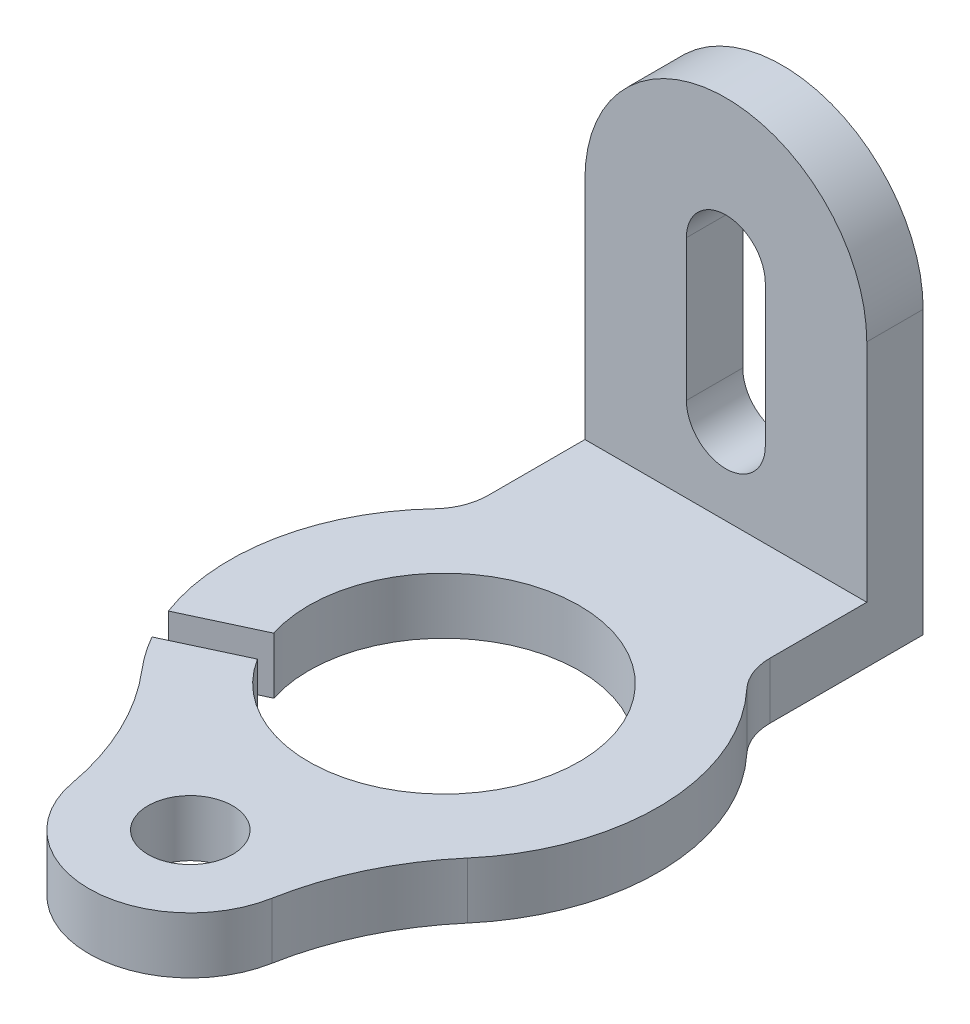
ISO-10303-21;
HEADER;
FILE_DESCRIPTION(('STEP AP214'),'2;1');
FILE_NAME('part.step','',(''),(''),'','','');
FILE_SCHEMA(('AUTOMOTIVE_DESIGN { 1 0 10303 214 1 1 1 1 }'));
ENDSEC;
DATA;
#1=APPLICATION_CONTEXT('core data for automotive mechanical design processes');
#2=APPLICATION_PROTOCOL_DEFINITION('international standard','automotive_design',2000,#1);
#3=PRODUCT_CONTEXT('',#1,'mechanical');
#4=PRODUCT('Part','Part','',(#3));
#5=PRODUCT_RELATED_PRODUCT_CATEGORY('part','',(#4));
#6=PRODUCT_DEFINITION_FORMATION('','',#4);
#7=PRODUCT_DEFINITION_CONTEXT('part definition',#1,'design');
#8=PRODUCT_DEFINITION('design','',#6,#7);
#9=PRODUCT_DEFINITION_SHAPE('','',#8);
#10=(LENGTH_UNIT() NAMED_UNIT(*) SI_UNIT(.MILLI.,.METRE.));
#11=(NAMED_UNIT(*) PLANE_ANGLE_UNIT() SI_UNIT($,.RADIAN.));
#12=(NAMED_UNIT(*) SI_UNIT($,.STERADIAN.) SOLID_ANGLE_UNIT());
#13=UNCERTAINTY_MEASURE_WITH_UNIT(LENGTH_MEASURE(1.E-05),#10,'distance_accuracy_value','');
#14=(GEOMETRIC_REPRESENTATION_CONTEXT(3) GLOBAL_UNCERTAINTY_ASSIGNED_CONTEXT((#13)) GLOBAL_UNIT_ASSIGNED_CONTEXT((#10,
#11,#12)) REPRESENTATION_CONTEXT('',''));
#15=CARTESIAN_POINT('',(0.,0.,0.));
#16=DIRECTION('',(0.,0.,1.));
#17=DIRECTION('',(1.,0.,0.));
#18=AXIS2_PLACEMENT_3D('',#15,#16,#17);
#19=CARTESIAN_POINT('',(0.,75.,0.));
#20=DIRECTION('',(0.,0.,1.));
#21=DIRECTION('',(1.,0.,0.));
#22=AXIS2_PLACEMENT_3D('',#19,#20,#21);
#23=PLANE('',#22);
#24=DIRECTION('',(0.,-1.,0.));
#25=VECTOR('',#24,1.);
#26=CARTESIAN_POINT('',(-6.99999999999999,0.,0.));
#27=LINE('',#26,#25);
#28=CARTESIAN_POINT('',(-7.,50.,0.));
#29=VERTEX_POINT('',#28);
#30=CARTESIAN_POINT('',(-7.,25.,0.));
#31=VERTEX_POINT('',#30);
#32=EDGE_CURVE('E111',#29,#31,#27,.T.);
#33=ORIENTED_EDGE('',*,*,#32,.F.);
#34=CARTESIAN_POINT('',(0.,50.,0.));
#35=DIRECTION('',(0.,0.,1.));
#36=DIRECTION('',(1.,0.,0.));
#37=AXIS2_PLACEMENT_3D('',#34,#35,#36);
#38=CIRCLE('',#37,7.);
#39=CARTESIAN_POINT('',(7.,50.,0.));
#40=VERTEX_POINT('',#39);
#41=EDGE_CURVE('E419',#40,#29,#38,.T.);
#42=ORIENTED_EDGE('',*,*,#41,.F.);
#43=DIRECTION('',(0.,-1.,0.));
#44=VECTOR('',#43,1.);
#45=CARTESIAN_POINT('',(7.00000000000001,0.,0.));
#46=LINE('',#45,#44);
#47=CARTESIAN_POINT('',(7.,25.,0.));
#48=VERTEX_POINT('',#47);
#49=EDGE_CURVE('E430',#40,#48,#46,.T.);
#50=ORIENTED_EDGE('',*,*,#49,.T.);
#51=CARTESIAN_POINT('',(0.,25.,0.));
#52=DIRECTION('',(0.,0.,1.));
#53=DIRECTION('',(1.,0.,0.));
#54=AXIS2_PLACEMENT_3D('',#51,#52,#53);
#55=CIRCLE('',#54,7.);
#56=EDGE_CURVE('E429',#31,#48,#55,.T.);
#57=ORIENTED_EDGE('',*,*,#56,.F.);
#58=EDGE_LOOP('',(#33,#42,#50,#57));
#59=FACE_BOUND('',#58,.T.);
#60=CARTESIAN_POINT('',(0.,50.,0.));
#61=DIRECTION('',(0.,0.,1.));
#62=DIRECTION('',(1.,0.,0.));
#63=AXIS2_PLACEMENT_3D('',#60,#61,#62);
#64=CIRCLE('',#63,25.);
#65=CARTESIAN_POINT('',(25.,50.,0.));
#66=VERTEX_POINT('',#65);
#67=CARTESIAN_POINT('',(-25.,50.,0.));
#68=VERTEX_POINT('',#67);
#69=EDGE_CURVE('E250',#66,#68,#64,.T.);
#70=ORIENTED_EDGE('',*,*,#69,.T.);
#71=DIRECTION('',(0.,-1.,0.));
#72=VECTOR('',#71,1.);
#73=CARTESIAN_POINT('',(-25.,75.,0.));
#74=LINE('',#73,#72);
#75=CARTESIAN_POINT('',(-25.,10.,0.));
#76=VERTEX_POINT('',#75);
#77=EDGE_CURVE('E255',#68,#76,#74,.T.);
#78=ORIENTED_EDGE('',*,*,#77,.T.);
#79=DIRECTION('',(-1.,0.,0.));
#80=VECTOR('',#79,1.);
#81=CARTESIAN_POINT('',(0.,10.,0.));
#82=LINE('',#81,#80);
#83=CARTESIAN_POINT('',(25.,9.99999999999999,0.));
#84=VERTEX_POINT('',#83);
#85=EDGE_CURVE('E294',#84,#76,#82,.T.);
#86=ORIENTED_EDGE('',*,*,#85,.F.);
#87=DIRECTION('',(0.,-1.,0.));
#88=VECTOR('',#87,1.);
#89=CARTESIAN_POINT('',(25.,75.,0.));
#90=LINE('',#89,#88);
#91=EDGE_CURVE('E263',#66,#84,#90,.T.);
#92=ORIENTED_EDGE('',*,*,#91,.F.);
#93=EDGE_LOOP('',(#70,#78,#86,#92));
#94=FACE_BOUND('',#93,.T.);
#95=ADVANCED_FACE('F97',(#59,#94),#23,.T.);
#96=CARTESIAN_POINT('',(-25.,10.,0.));
#97=DIRECTION('',(1.,0.,0.));
#98=DIRECTION('',(0.,0.,-1.));
#99=AXIS2_PLACEMENT_3D('',#96,#97,#98);
#100=PLANE('',#99);
#101=DIRECTION('',(0.,0.,1.));
#102=VECTOR('',#101,1.);
#103=CARTESIAN_POINT('',(-25.,50.,-10.001));
#104=LINE('',#103,#102);
#105=CARTESIAN_POINT('',(-25.,50.,-9.99999999999999));
#106=VERTEX_POINT('',#105);
#107=EDGE_CURVE('E238',#106,#68,#104,.T.);
#108=ORIENTED_EDGE('',*,*,#107,.F.);
#109=DIRECTION('',(0.,-1.,0.));
#110=VECTOR('',#109,1.);
#111=CARTESIAN_POINT('',(-25.,75.,-9.99999999999999));
#112=LINE('',#111,#110);
#113=CARTESIAN_POINT('',(-25.,0.,-9.99999999999999));
#114=VERTEX_POINT('',#113);
#115=EDGE_CURVE('E253',#106,#114,#112,.T.);
#116=ORIENTED_EDGE('',*,*,#115,.T.);
#117=DIRECTION('',(0.,0.,1.));
#118=VECTOR('',#117,1.);
#119=CARTESIAN_POINT('',(-25.,0.,0.));
#120=LINE('',#119,#118);
#121=CARTESIAN_POINT('',(-25.,0.,17.1518645886863));
#122=VERTEX_POINT('',#121);
#123=EDGE_CURVE('E331',#114,#122,#120,.T.);
#124=ORIENTED_EDGE('',*,*,#123,.T.);
#125=DIRECTION('',(0.,-1.,0.));
#126=VECTOR('',#125,1.);
#127=CARTESIAN_POINT('',(-25.,10.,17.1518645886863));
#128=LINE('',#127,#126);
#129=CARTESIAN_POINT('',(-25.,10.,17.1518645886863));
#130=VERTEX_POINT('',#129);
#131=EDGE_CURVE('E351',#130,#122,#128,.T.);
#132=ORIENTED_EDGE('',*,*,#131,.F.);
#133=DIRECTION('',(0.,0.,1.));
#134=VECTOR('',#133,1.);
#135=CARTESIAN_POINT('',(-25.,10.,0.));
#136=LINE('',#135,#134);
#137=EDGE_CURVE('E300',#76,#130,#136,.T.);
#138=ORIENTED_EDGE('',*,*,#137,.F.);
#139=ORIENTED_EDGE('',*,*,#77,.F.);
#140=EDGE_LOOP('',(#108,#116,#124,#132,#138,#139));
#141=FACE_BOUND('',#140,.T.);
#142=ADVANCED_FACE('F248',(#141),#100,.F.);
#143=CARTESIAN_POINT('',(25.,10.,0.));
#144=DIRECTION('',(1.,0.,0.));
#145=DIRECTION('',(0.,0.,-1.));
#146=AXIS2_PLACEMENT_3D('',#143,#144,#145);
#147=PLANE('',#146);
#148=DIRECTION('',(0.,-1.,0.));
#149=VECTOR('',#148,1.);
#150=CARTESIAN_POINT('',(25.,75.,-10.));
#151=LINE('',#150,#149);
#152=CARTESIAN_POINT('',(25.,50.,-10.));
#153=VERTEX_POINT('',#152);
#154=CARTESIAN_POINT('',(25.,0.,-10.));
#155=VERTEX_POINT('',#154);
#156=EDGE_CURVE('E261',#153,#155,#151,.T.);
#157=ORIENTED_EDGE('',*,*,#156,.F.);
#158=DIRECTION('',(0.,0.,1.));
#159=VECTOR('',#158,1.);
#160=CARTESIAN_POINT('',(25.,50.,-10.001));
#161=LINE('',#160,#159);
#162=EDGE_CURVE('E244',#153,#66,#161,.T.);
#163=ORIENTED_EDGE('',*,*,#162,.T.);
#164=ORIENTED_EDGE('',*,*,#91,.T.);
#165=DIRECTION('',(0.,0.,1.));
#166=VECTOR('',#165,1.);
#167=CARTESIAN_POINT('',(25.,10.,0.));
#168=LINE('',#167,#166);
#169=CARTESIAN_POINT('',(25.,10.,17.1518645886863));
#170=VERTEX_POINT('',#169);
#171=EDGE_CURVE('E292',#84,#170,#168,.T.);
#172=ORIENTED_EDGE('',*,*,#171,.T.);
#173=DIRECTION('',(0.,-1.,0.));
#174=VECTOR('',#173,1.);
#175=CARTESIAN_POINT('',(25.,10.,17.1518645886863));
#176=LINE('',#175,#174);
#177=CARTESIAN_POINT('',(25.,0.,17.1518645886863));
#178=VERTEX_POINT('',#177);
#179=EDGE_CURVE('E360',#170,#178,#176,.T.);
#180=ORIENTED_EDGE('',*,*,#179,.T.);
#181=DIRECTION('',(0.,0.,1.));
#182=VECTOR('',#181,1.);
#183=CARTESIAN_POINT('',(25.,0.,0.));
#184=LINE('',#183,#182);
#185=EDGE_CURVE('E332',#155,#178,#184,.T.);
#186=ORIENTED_EDGE('',*,*,#185,.F.);
#187=EDGE_LOOP('',(#157,#163,#164,#172,#180,#186));
#188=FACE_BOUND('',#187,.T.);
#189=ADVANCED_FACE('F447',(#188),#147,.T.);
#190=CARTESIAN_POINT('',(20.4189658631966,10.,43.7886136032735));
#191=DIRECTION('',(0.4226182617407,0.,0.90630778703665));
#192=DIRECTION('',(0.90630778703665,0.,-0.4226182617407));
#193=AXIS2_PLACEMENT_3D('',#190,#191,#192);
#194=PLANE('',#193);
#195=DIRECTION('',(-0.90630778703665,0.,0.4226182617407));
#196=VECTOR('',#195,1.);
#197=CARTESIAN_POINT('',(20.4189658631966,0.,43.7886136032735));
#198=LINE('',#197,#196);
#199=CARTESIAN_POINT('',(-20.3129303568002,0.,62.7822087418326));
#200=VERTEX_POINT('',#199);
#201=CARTESIAN_POINT('',(-33.06434744461,0.,68.7282921822069));
#202=VERTEX_POINT('',#201);
#203=EDGE_CURVE('E315',#200,#202,#198,.T.);
#204=ORIENTED_EDGE('',*,*,#203,.T.);
#205=DIRECTION('',(0.,-1.,0.));
#206=VECTOR('',#205,1.);
#207=CARTESIAN_POINT('',(-33.06434744461,10.,68.7282921822069));
#208=LINE('',#207,#206);
#209=CARTESIAN_POINT('',(-33.06434744461,10.,68.7282921822069));
#210=VERTEX_POINT('',#209);
#211=EDGE_CURVE('E12',#210,#202,#208,.T.);
#212=ORIENTED_EDGE('',*,*,#211,.F.);
#213=DIRECTION('',(-0.90630778703665,0.,0.4226182617407));
#214=VECTOR('',#213,1.);
#215=CARTESIAN_POINT('',(20.4189658631966,10.,43.7886136032735));
#216=LINE('',#215,#214);
#217=CARTESIAN_POINT('',(-20.3129303568002,10.,62.7822087418326));
#218=VERTEX_POINT('',#217);
#219=EDGE_CURVE('E272',#218,#210,#216,.T.);
#220=ORIENTED_EDGE('',*,*,#219,.F.);
#221=DIRECTION('',(0.,-1.,0.));
#222=VECTOR('',#221,1.);
#223=CARTESIAN_POINT('',(-20.3129303568002,10.,62.7822087418326));
#224=LINE('',#223,#222);
#225=EDGE_CURVE('E310',#218,#200,#224,.T.);
#226=ORIENTED_EDGE('',*,*,#225,.T.);
#227=EDGE_LOOP('',(#204,#212,#220,#226));
#228=FACE_BOUND('',#227,.T.);
#229=ADVANCED_FACE('F394',(#228),#194,.F.);
#230=CARTESIAN_POINT('',(0.,10.,50.));
#231=DIRECTION('',(0.,-1.,0.));
#232=DIRECTION('',(0.,0.,-1.));
#233=AXIS2_PLACEMENT_3D('',#230,#231,#232);
#234=CYLINDRICAL_SURFACE('',#233,38.);
#235=CARTESIAN_POINT('',(0.,0.,50.));
#236=DIRECTION('',(0.,1.,0.));
#237=DIRECTION('',(0.,0.,1.));
#238=AXIS2_PLACEMENT_3D('',#235,#236,#237);
#239=CIRCLE('',#238,38.);
#240=CARTESIAN_POINT('',(-28.8898053544943,0.,74.6856060606061));
#241=VERTEX_POINT('',#240);
#242=EDGE_CURVE('E312',#202,#241,#239,.T.);
#243=ORIENTED_EDGE('',*,*,#242,.T.);
#244=DIRECTION('',(0.,-1.,0.));
#245=VECTOR('',#244,1.);
#246=CARTESIAN_POINT('',(-28.8898053544943,10.,74.6856060606061));
#247=LINE('',#246,#245);
#248=CARTESIAN_POINT('',(-28.8898053544943,10.,74.6856060606061));
#249=VERTEX_POINT('',#248);
#250=EDGE_CURVE('E110',#249,#241,#247,.T.);
#251=ORIENTED_EDGE('',*,*,#250,.F.);
#252=CARTESIAN_POINT('',(0.,10.,50.));
#253=DIRECTION('',(0.,1.,0.));
#254=DIRECTION('',(0.,0.,1.));
#255=AXIS2_PLACEMENT_3D('',#252,#253,#254);
#256=CIRCLE('',#255,38.);
#257=EDGE_CURVE('E280',#210,#249,#256,.T.);
#258=ORIENTED_EDGE('',*,*,#257,.F.);
#259=ORIENTED_EDGE('',*,*,#211,.T.);
#260=EDGE_LOOP('',(#243,#251,#258,#259));
#261=FACE_BOUND('',#260,.T.);
#262=ADVANCED_FACE('F392',(#261),#234,.T.);
#263=CARTESIAN_POINT('',(-66.9027071367237,10.,107.166666666667));
#264=DIRECTION('',(0.,-1.,0.));
#265=DIRECTION('',(0.,0.,-1.));
#266=AXIS2_PLACEMENT_3D('',#263,#264,#265);
#267=CYLINDRICAL_SURFACE('',#266,50.);
#268=CARTESIAN_POINT('',(-66.9027071367237,0.,107.166666666667));
#269=DIRECTION('',(0.,1.,0.));
#270=DIRECTION('',(0.,0.,1.));
#271=AXIS2_PLACEMENT_3D('',#268,#269,#270);
#272=CIRCLE('',#271,50.);
#273=CARTESIAN_POINT('',(-17.7095401244269,0.,98.2205882352941));
#274=VERTEX_POINT('',#273);
#275=EDGE_CURVE('E320',#241,#274,#272,.F.);
#276=ORIENTED_EDGE('',*,*,#275,.T.);
#277=DIRECTION('',(0.,-1.,0.));
#278=VECTOR('',#277,1.);
#279=CARTESIAN_POINT('',(-17.7095401244269,10.,98.2205882352941));
#280=LINE('',#279,#278);
#281=CARTESIAN_POINT('',(-17.7095401244269,10.,98.2205882352941));
#282=VERTEX_POINT('',#281);
#283=EDGE_CURVE('E364',#282,#274,#280,.T.);
#284=ORIENTED_EDGE('',*,*,#283,.F.);
#285=CARTESIAN_POINT('',(-66.9027071367237,10.,107.166666666667));
#286=DIRECTION('',(0.,1.,0.));
#287=DIRECTION('',(0.,0.,1.));
#288=AXIS2_PLACEMENT_3D('',#285,#286,#287);
#289=CIRCLE('',#288,50.);
#290=EDGE_CURVE('E276',#249,#282,#289,.F.);
#291=ORIENTED_EDGE('',*,*,#290,.F.);
#292=ORIENTED_EDGE('',*,*,#250,.T.);
#293=EDGE_LOOP('',(#276,#284,#291,#292));
#294=FACE_BOUND('',#293,.T.);
#295=ADVANCED_FACE('F375',(#294),#267,.F.);
#296=CARTESIAN_POINT('',(0.,10.,95.));
#297=DIRECTION('',(0.,-1.,0.));
#298=DIRECTION('',(0.,0.,-1.));
#299=AXIS2_PLACEMENT_3D('',#296,#297,#298);
#300=CYLINDRICAL_SURFACE('',#299,18.);
#301=CARTESIAN_POINT('',(0.,0.,95.));
#302=DIRECTION('',(0.,1.,0.));
#303=DIRECTION('',(0.,0.,1.));
#304=AXIS2_PLACEMENT_3D('',#301,#302,#303);
#305=CIRCLE('',#304,18.);
#306=CARTESIAN_POINT('',(17.7095401244269,0.,98.2205882352941));
#307=VERTEX_POINT('',#306);
#308=EDGE_CURVE('E317',#274,#307,#305,.T.);
#309=ORIENTED_EDGE('',*,*,#308,.T.);
#310=DIRECTION('',(0.,-1.,0.));
#311=VECTOR('',#310,1.);
#312=CARTESIAN_POINT('',(17.7095401244269,10.,98.2205882352941));
#313=LINE('',#312,#311);
#314=CARTESIAN_POINT('',(17.7095401244269,10.,98.2205882352941));
#315=VERTEX_POINT('',#314);
#316=EDGE_CURVE('E361',#315,#307,#313,.T.);
#317=ORIENTED_EDGE('',*,*,#316,.F.);
#318=CARTESIAN_POINT('',(0.,10.,95.));
#319=DIRECTION('',(0.,1.,0.));
#320=DIRECTION('',(0.,0.,1.));
#321=AXIS2_PLACEMENT_3D('',#318,#319,#320);
#322=CIRCLE('',#321,18.);
#323=EDGE_CURVE('E282',#282,#315,#322,.T.);
#324=ORIENTED_EDGE('',*,*,#323,.F.);
#325=ORIENTED_EDGE('',*,*,#283,.T.);
#326=EDGE_LOOP('',(#309,#317,#324,#325));
#327=FACE_BOUND('',#326,.T.);
#328=ADVANCED_FACE('F382',(#327),#300,.T.);
#329=CARTESIAN_POINT('',(66.9027071367237,10.,107.166666666667));
#330=DIRECTION('',(0.,-1.,0.));
#331=DIRECTION('',(0.,0.,-1.));
#332=AXIS2_PLACEMENT_3D('',#329,#330,#331);
#333=CYLINDRICAL_SURFACE('',#332,50.);
#334=CARTESIAN_POINT('',(66.9027071367237,0.,107.166666666667));
#335=DIRECTION('',(0.,1.,0.));
#336=DIRECTION('',(0.,0.,1.));
#337=AXIS2_PLACEMENT_3D('',#334,#335,#336);
#338=CIRCLE('',#337,50.);
#339=CARTESIAN_POINT('',(28.8898053544943,0.,74.6856060606061));
#340=VERTEX_POINT('',#339);
#341=EDGE_CURVE('E325',#340,#307,#338,.T.);
#342=ORIENTED_EDGE('',*,*,#341,.F.);
#343=DIRECTION('',(0.,-1.,0.));
#344=VECTOR('',#343,1.);
#345=CARTESIAN_POINT('',(28.8898053544943,10.,74.6856060606061));
#346=LINE('',#345,#344);
#347=CARTESIAN_POINT('',(28.8898053544943,10.,74.6856060606061));
#348=VERTEX_POINT('',#347);
#349=EDGE_CURVE('E363',#348,#340,#346,.T.);
#350=ORIENTED_EDGE('',*,*,#349,.F.);
#351=CARTESIAN_POINT('',(66.9027071367237,10.,107.166666666667));
#352=DIRECTION('',(0.,1.,0.));
#353=DIRECTION('',(0.,0.,1.));
#354=AXIS2_PLACEMENT_3D('',#351,#352,#353);
#355=CIRCLE('',#354,50.);
#356=EDGE_CURVE('E284',#348,#315,#355,.T.);
#357=ORIENTED_EDGE('',*,*,#356,.T.);
#358=ORIENTED_EDGE('',*,*,#316,.T.);
#359=EDGE_LOOP('',(#342,#350,#357,#358));
#360=FACE_BOUND('',#359,.T.);
#361=ADVANCED_FACE('F453',(#360),#333,.F.);
#362=CARTESIAN_POINT('',(0.,10.,50.));
#363=DIRECTION('',(0.,-1.,0.));
#364=DIRECTION('',(0.,0.,-1.));
#365=AXIS2_PLACEMENT_3D('',#362,#363,#364);
#366=CYLINDRICAL_SURFACE('',#365,38.);
#367=CARTESIAN_POINT('',(0.,0.,50.));
#368=DIRECTION('',(0.,1.,0.));
#369=DIRECTION('',(0.,0.,1.));
#370=AXIS2_PLACEMENT_3D('',#367,#368,#369);
#371=CIRCLE('',#370,38.);
#372=CARTESIAN_POINT('',(27.7083333333333,0.,23.99522613271));
#373=VERTEX_POINT('',#372);
#374=EDGE_CURVE('E324',#340,#373,#371,.T.);
#375=ORIENTED_EDGE('',*,*,#374,.T.);
#376=DIRECTION('',(0.,-1.,0.));
#377=VECTOR('',#376,1.);
#378=CARTESIAN_POINT('',(27.7083333333333,10.,23.99522613271));
#379=LINE('',#378,#377);
#380=CARTESIAN_POINT('',(27.7083333333333,10.,23.99522613271));
#381=VERTEX_POINT('',#380);
#382=EDGE_CURVE('E356',#381,#373,#379,.T.);
#383=ORIENTED_EDGE('',*,*,#382,.F.);
#384=CARTESIAN_POINT('',(0.,10.,50.));
#385=DIRECTION('',(0.,1.,0.));
#386=DIRECTION('',(0.,0.,1.));
#387=AXIS2_PLACEMENT_3D('',#384,#385,#386);
#388=CIRCLE('',#387,38.);
#389=EDGE_CURVE('E287',#348,#381,#388,.T.);
#390=ORIENTED_EDGE('',*,*,#389,.F.);
#391=ORIENTED_EDGE('',*,*,#349,.T.);
#392=EDGE_LOOP('',(#375,#383,#390,#391));
#393=FACE_BOUND('',#392,.T.);
#394=ADVANCED_FACE('F460',(#393),#366,.T.);
#395=CARTESIAN_POINT('',(35.,10.,17.1518645886863));
#396=DIRECTION('',(0.,-1.,0.));
#397=DIRECTION('',(0.,0.,-1.));
#398=AXIS2_PLACEMENT_3D('',#395,#396,#397);
#399=CYLINDRICAL_SURFACE('',#398,10.);
#400=CARTESIAN_POINT('',(35.,0.,17.1518645886863));
#401=DIRECTION('',(0.,1.,0.));
#402=DIRECTION('',(0.,0.,1.));
#403=AXIS2_PLACEMENT_3D('',#400,#401,#402);
#404=CIRCLE('',#403,10.);
#405=EDGE_CURVE('E327',#178,#373,#404,.T.);
#406=ORIENTED_EDGE('',*,*,#405,.F.);
#407=ORIENTED_EDGE('',*,*,#179,.F.);
#408=CARTESIAN_POINT('',(35.,10.,17.1518645886863));
#409=DIRECTION('',(0.,1.,0.));
#410=DIRECTION('',(0.,0.,1.));
#411=AXIS2_PLACEMENT_3D('',#408,#409,#410);
#412=CIRCLE('',#411,10.);
#413=EDGE_CURVE('E289',#170,#381,#412,.T.);
#414=ORIENTED_EDGE('',*,*,#413,.T.);
#415=ORIENTED_EDGE('',*,*,#382,.T.);
#416=EDGE_LOOP('',(#406,#407,#414,#415));
#417=FACE_BOUND('',#416,.T.);
#418=ADVANCED_FACE('F452',(#417),#399,.F.);
#419=CARTESIAN_POINT('',(-35.,10.,17.1518645886863));
#420=DIRECTION('',(0.,-1.,0.));
#421=DIRECTION('',(0.,0.,-1.));
#422=AXIS2_PLACEMENT_3D('',#419,#420,#421);
#423=CYLINDRICAL_SURFACE('',#422,10.);
#424=CARTESIAN_POINT('',(-35.,0.,17.1518645886863));
#425=DIRECTION('',(0.,1.,0.));
#426=DIRECTION('',(0.,0.,1.));
#427=AXIS2_PLACEMENT_3D('',#424,#425,#426);
#428=CIRCLE('',#427,10.);
#429=CARTESIAN_POINT('',(-27.7083333333333,0.,23.99522613271));
#430=VERTEX_POINT('',#429);
#431=EDGE_CURVE('E337',#122,#430,#428,.F.);
#432=ORIENTED_EDGE('',*,*,#431,.T.);
#433=DIRECTION('',(0.,-1.,0.));
#434=VECTOR('',#433,1.);
#435=CARTESIAN_POINT('',(-27.7083333333333,10.,23.99522613271));
#436=LINE('',#435,#434);
#437=CARTESIAN_POINT('',(-27.7083333333333,10.,23.99522613271));
#438=VERTEX_POINT('',#437);
#439=EDGE_CURVE('E352',#438,#430,#436,.T.);
#440=ORIENTED_EDGE('',*,*,#439,.F.);
#441=CARTESIAN_POINT('',(-35.,10.,17.1518645886863));
#442=DIRECTION('',(0.,1.,0.));
#443=DIRECTION('',(0.,0.,1.));
#444=AXIS2_PLACEMENT_3D('',#441,#442,#443);
#445=CIRCLE('',#444,10.);
#446=EDGE_CURVE('E296',#130,#438,#445,.F.);
#447=ORIENTED_EDGE('',*,*,#446,.F.);
#448=ORIENTED_EDGE('',*,*,#131,.T.);
#449=EDGE_LOOP('',(#432,#440,#447,#448));
#450=FACE_BOUND('',#449,.T.);
#451=ADVANCED_FACE('F408',(#450),#423,.F.);
#452=CARTESIAN_POINT('',(0.,10.,50.));
#453=DIRECTION('',(0.,-1.,0.));
#454=DIRECTION('',(0.,0.,-1.));
#455=AXIS2_PLACEMENT_3D('',#452,#453,#454);
#456=CYLINDRICAL_SURFACE('',#455,38.);
#457=CARTESIAN_POINT('',(0.,0.,50.));
#458=DIRECTION('',(0.,1.,0.));
#459=DIRECTION('',(0.,0.,1.));
#460=AXIS2_PLACEMENT_3D('',#457,#458,#459);
#461=CIRCLE('',#460,38.);
#462=CARTESIAN_POINT('',(-35.6000570150542,0.,63.290445459987));
#463=VERTEX_POINT('',#462);
#464=EDGE_CURVE('E339',#430,#463,#461,.T.);
#465=ORIENTED_EDGE('',*,*,#464,.T.);
#466=DIRECTION('',(0.,-1.,0.));
#467=VECTOR('',#466,1.);
#468=CARTESIAN_POINT('',(-35.6000570150542,10.,63.290445459987));
#469=LINE('',#468,#467);
#470=CARTESIAN_POINT('',(-35.6000570150542,10.,63.290445459987));
#471=VERTEX_POINT('',#470);
#472=EDGE_CURVE('E349',#471,#463,#469,.T.);
#473=ORIENTED_EDGE('',*,*,#472,.F.);
#474=CARTESIAN_POINT('',(0.,10.,50.));
#475=DIRECTION('',(0.,1.,0.));
#476=DIRECTION('',(0.,0.,1.));
#477=AXIS2_PLACEMENT_3D('',#474,#475,#476);
#478=CIRCLE('',#477,38.);
#479=EDGE_CURVE('E302',#438,#471,#478,.T.);
#480=ORIENTED_EDGE('',*,*,#479,.F.);
#481=ORIENTED_EDGE('',*,*,#439,.T.);
#482=EDGE_LOOP('',(#465,#473,#480,#481));
#483=FACE_BOUND('',#482,.T.);
#484=ADVANCED_FACE('F403',(#483),#456,.T.);
#485=CARTESIAN_POINT('',(17.8832562927524,10.,38.3507668810535));
#486=DIRECTION('',(0.422618261740701,0.,0.90630778703665));
#487=DIRECTION('',(0.90630778703665,0.,-0.422618261740701));
#488=AXIS2_PLACEMENT_3D('',#485,#486,#487);
#489=PLANE('',#488);
#490=DIRECTION('',(-0.90630778703665,0.,0.422618261740701));
#491=VECTOR('',#490,1.);
#492=CARTESIAN_POINT('',(17.8832562927524,0.,38.3507668810535));
#493=LINE('',#492,#491);
#494=CARTESIAN_POINT('',(-22.8486399272445,0.,57.3443620196128));
#495=VERTEX_POINT('',#494);
#496=EDGE_CURVE('E342',#495,#463,#493,.T.);
#497=ORIENTED_EDGE('',*,*,#496,.F.);
#498=DIRECTION('',(0.,-1.,0.));
#499=VECTOR('',#498,1.);
#500=CARTESIAN_POINT('',(-22.8486399272445,10.,57.3443620196128));
#501=LINE('',#500,#499);
#502=CARTESIAN_POINT('',(-22.8486399272445,10.,57.3443620196128));
#503=VERTEX_POINT('',#502);
#504=EDGE_CURVE('E350',#503,#495,#501,.T.);
#505=ORIENTED_EDGE('',*,*,#504,.F.);
#506=DIRECTION('',(-0.90630778703665,0.,0.422618261740701));
#507=VECTOR('',#506,1.);
#508=CARTESIAN_POINT('',(17.8832562927524,10.,38.3507668810535));
#509=LINE('',#508,#507);
#510=EDGE_CURVE('E304',#503,#471,#509,.T.);
#511=ORIENTED_EDGE('',*,*,#510,.T.);
#512=ORIENTED_EDGE('',*,*,#472,.T.);
#513=EDGE_LOOP('',(#497,#505,#511,#512));
#514=FACE_BOUND('',#513,.T.);
#515=ADVANCED_FACE('F398',(#514),#489,.T.);
#516=CARTESIAN_POINT('',(0.,10.,95.));
#517=DIRECTION('',(0.,-1.,0.));
#518=DIRECTION('',(0.,0.,-1.));
#519=AXIS2_PLACEMENT_3D('',#516,#517,#518);
#520=CYLINDRICAL_SURFACE('',#519,7.5);
#521=CARTESIAN_POINT('',(0.,10.,95.));
#522=DIRECTION('',(0.,1.,0.));
#523=DIRECTION('',(0.,0.,1.));
#524=AXIS2_PLACEMENT_3D('',#521,#522,#523);
#525=CIRCLE('',#524,7.5);
#526=CARTESIAN_POINT('',(0.,10.,102.5));
#527=VERTEX_POINT('',#526);
#528=EDGE_CURVE('E269',#527,#527,#525,.T.);
#529=ORIENTED_EDGE('',*,*,#528,.T.);
#530=EDGE_LOOP('',(#529));
#531=FACE_BOUND('',#530,.T.);
#532=CARTESIAN_POINT('',(0.,0.,95.));
#533=DIRECTION('',(0.,1.,0.));
#534=DIRECTION('',(0.,0.,1.));
#535=AXIS2_PLACEMENT_3D('',#532,#533,#534);
#536=CIRCLE('',#535,7.5);
#537=CARTESIAN_POINT('',(0.,0.,102.5));
#538=VERTEX_POINT('',#537);
#539=EDGE_CURVE('E267',#538,#538,#536,.T.);
#540=ORIENTED_EDGE('',*,*,#539,.F.);
#541=EDGE_LOOP('',(#540));
#542=FACE_BOUND('',#541,.T.);
#543=ADVANCED_FACE('F101',(#531,#542),#520,.F.);
#544=CARTESIAN_POINT('',(0.,10.,50.));
#545=DIRECTION('',(0.,-1.,0.));
#546=DIRECTION('',(0.,0.,-1.));
#547=AXIS2_PLACEMENT_3D('',#544,#545,#546);
#548=CYLINDRICAL_SURFACE('',#547,24.);
#549=CARTESIAN_POINT('',(0.,0.,50.));
#550=DIRECTION('',(0.,1.,0.));
#551=DIRECTION('',(0.,0.,1.));
#552=AXIS2_PLACEMENT_3D('',#549,#550,#551);
#553=CIRCLE('',#552,24.);
#554=EDGE_CURVE('E273',#200,#495,#553,.T.);
#555=ORIENTED_EDGE('',*,*,#554,.F.);
#556=ORIENTED_EDGE('',*,*,#225,.F.);
#557=CARTESIAN_POINT('',(0.,10.,50.));
#558=DIRECTION('',(0.,1.,0.));
#559=DIRECTION('',(0.,0.,1.));
#560=AXIS2_PLACEMENT_3D('',#557,#558,#559);
#561=CIRCLE('',#560,24.);
#562=EDGE_CURVE('E308',#218,#503,#561,.T.);
#563=ORIENTED_EDGE('',*,*,#562,.T.);
#564=ORIENTED_EDGE('',*,*,#504,.T.);
#565=EDGE_LOOP('',(#555,#556,#563,#564));
#566=FACE_BOUND('',#565,.T.);
#567=ADVANCED_FACE('F397',(#566),#548,.F.);
#568=CARTESIAN_POINT('',(0.,10.,0.));
#569=DIRECTION('',(0.,1.,0.));
#570=DIRECTION('',(0.,0.,1.));
#571=AXIS2_PLACEMENT_3D('',#568,#569,#570);
#572=PLANE('',#571);
#573=ORIENTED_EDGE('',*,*,#528,.F.);
#574=EDGE_LOOP('',(#573));
#575=FACE_BOUND('',#574,.T.);
#576=ORIENTED_EDGE('',*,*,#219,.T.);
#577=ORIENTED_EDGE('',*,*,#257,.T.);
#578=ORIENTED_EDGE('',*,*,#290,.T.);
#579=ORIENTED_EDGE('',*,*,#323,.T.);
#580=ORIENTED_EDGE('',*,*,#356,.F.);
#581=ORIENTED_EDGE('',*,*,#389,.T.);
#582=ORIENTED_EDGE('',*,*,#413,.F.);
#583=ORIENTED_EDGE('',*,*,#171,.F.);
#584=ORIENTED_EDGE('',*,*,#85,.T.);
#585=ORIENTED_EDGE('',*,*,#137,.T.);
#586=ORIENTED_EDGE('',*,*,#446,.T.);
#587=ORIENTED_EDGE('',*,*,#479,.T.);
#588=ORIENTED_EDGE('',*,*,#510,.F.);
#589=ORIENTED_EDGE('',*,*,#562,.F.);
#590=EDGE_LOOP('',(#576,#577,#578,#579,#580,#581,#582,#583,#584,#585,#586,#587,#588,#589));
#591=FACE_BOUND('',#590,.T.);
#592=ADVANCED_FACE('F390',(#575,#591),#572,.T.);
#593=CARTESIAN_POINT('',(0.,0.,0.));
#594=DIRECTION('',(0.,1.,0.));
#595=DIRECTION('',(0.,0.,1.));
#596=AXIS2_PLACEMENT_3D('',#593,#594,#595);
#597=PLANE('',#596);
#598=ORIENTED_EDGE('',*,*,#539,.T.);
#599=EDGE_LOOP('',(#598));
#600=FACE_BOUND('',#599,.T.);
#601=ORIENTED_EDGE('',*,*,#203,.F.);
#602=ORIENTED_EDGE('',*,*,#554,.T.);
#603=ORIENTED_EDGE('',*,*,#496,.T.);
#604=ORIENTED_EDGE('',*,*,#464,.F.);
#605=ORIENTED_EDGE('',*,*,#431,.F.);
#606=ORIENTED_EDGE('',*,*,#123,.F.);
#607=DIRECTION('',(1.,0.,0.));
#608=VECTOR('',#607,1.);
#609=CARTESIAN_POINT('',(0.,0.,-10.));
#610=LINE('',#609,#608);
#611=EDGE_CURVE('E257',#114,#155,#610,.T.);
#612=ORIENTED_EDGE('',*,*,#611,.T.);
#613=ORIENTED_EDGE('',*,*,#185,.T.);
#614=ORIENTED_EDGE('',*,*,#405,.T.);
#615=ORIENTED_EDGE('',*,*,#374,.F.);
#616=ORIENTED_EDGE('',*,*,#341,.T.);
#617=ORIENTED_EDGE('',*,*,#308,.F.);
#618=ORIENTED_EDGE('',*,*,#275,.F.);
#619=ORIENTED_EDGE('',*,*,#242,.F.);
#620=EDGE_LOOP('',(#601,#602,#603,#604,#605,#606,#612,#613,#614,#615,#616,#617,#618,#619));
#621=FACE_BOUND('',#620,.T.);
#622=ADVANCED_FACE('F378',(#600,#621),#597,.F.);
#623=CARTESIAN_POINT('',(0.,75.,-10.));
#624=DIRECTION('',(0.,0.,-1.));
#625=DIRECTION('',(-1.,0.,0.));
#626=AXIS2_PLACEMENT_3D('',#623,#624,#625);
#627=PLANE('',#626);
#628=ORIENTED_EDGE('',*,*,#115,.F.);
#629=CARTESIAN_POINT('',(0.,50.,-10.));
#630=DIRECTION('',(0.,0.,-1.));
#631=DIRECTION('',(-1.,0.,0.));
#632=AXIS2_PLACEMENT_3D('',#629,#630,#631);
#633=CIRCLE('',#632,25.);
#634=EDGE_CURVE('E240',#153,#106,#633,.F.);
#635=ORIENTED_EDGE('',*,*,#634,.F.);
#636=ORIENTED_EDGE('',*,*,#156,.T.);
#637=ORIENTED_EDGE('',*,*,#611,.F.);
#638=EDGE_LOOP('',(#628,#635,#636,#637));
#639=FACE_BOUND('',#638,.T.);
#640=DIRECTION('',(0.,-1.,0.));
#641=VECTOR('',#640,1.);
#642=CARTESIAN_POINT('',(-6.99999999999999,0.,-10.));
#643=LINE('',#642,#641);
#644=CARTESIAN_POINT('',(-7.,50.,-10.));
#645=VERTEX_POINT('',#644);
#646=CARTESIAN_POINT('',(-7.,25.,-10.));
#647=VERTEX_POINT('',#646);
#648=EDGE_CURVE('E433',#645,#647,#643,.T.);
#649=ORIENTED_EDGE('',*,*,#648,.T.);
#650=CARTESIAN_POINT('',(0.,25.,-10.));
#651=DIRECTION('',(0.,0.,-1.));
#652=DIRECTION('',(-1.,0.,0.));
#653=AXIS2_PLACEMENT_3D('',#650,#651,#652);
#654=CIRCLE('',#653,7.);
#655=CARTESIAN_POINT('',(7.,25.,-10.));
#656=VERTEX_POINT('',#655);
#657=EDGE_CURVE('E414',#647,#656,#654,.F.);
#658=ORIENTED_EDGE('',*,*,#657,.T.);
#659=DIRECTION('',(0.,-1.,0.));
#660=VECTOR('',#659,1.);
#661=CARTESIAN_POINT('',(7.00000000000001,0.,-10.));
#662=LINE('',#661,#660);
#663=CARTESIAN_POINT('',(7.,50.,-10.));
#664=VERTEX_POINT('',#663);
#665=EDGE_CURVE('E438',#664,#656,#662,.T.);
#666=ORIENTED_EDGE('',*,*,#665,.F.);
#667=CARTESIAN_POINT('',(0.,50.,-10.));
#668=DIRECTION('',(0.,0.,-1.));
#669=DIRECTION('',(-1.,0.,0.));
#670=AXIS2_PLACEMENT_3D('',#667,#668,#669);
#671=CIRCLE('',#670,7.);
#672=EDGE_CURVE('E436',#664,#645,#671,.F.);
#673=ORIENTED_EDGE('',*,*,#672,.T.);
#674=EDGE_LOOP('',(#649,#658,#666,#673));
#675=FACE_BOUND('',#674,.T.);
#676=ADVANCED_FACE('F260',(#639,#675),#627,.T.);
#677=CARTESIAN_POINT('',(-6.99999999999999,0.,-10.001));
#678=DIRECTION('',(-1.,0.,0.));
#679=DIRECTION('',(0.,-1.,0.));
#680=AXIS2_PLACEMENT_3D('',#677,#678,#679);
#681=PLANE('',#680);
#682=DIRECTION('',(0.,0.,1.));
#683=VECTOR('',#682,1.);
#684=CARTESIAN_POINT('',(-7.,50.,-10.001));
#685=LINE('',#684,#683);
#686=EDGE_CURVE('E413',#645,#29,#685,.T.);
#687=ORIENTED_EDGE('',*,*,#686,.T.);
#688=ORIENTED_EDGE('',*,*,#32,.T.);
#689=DIRECTION('',(0.,0.,1.));
#690=VECTOR('',#689,1.);
#691=CARTESIAN_POINT('',(-7.,25.,-10.001));
#692=LINE('',#691,#690);
#693=EDGE_CURVE('E416',#647,#31,#692,.T.);
#694=ORIENTED_EDGE('',*,*,#693,.F.);
#695=ORIENTED_EDGE('',*,*,#648,.F.);
#696=EDGE_LOOP('',(#687,#688,#694,#695));
#697=FACE_BOUND('',#696,.T.);
#698=ADVANCED_FACE('F579',(#697),#681,.F.);
#699=CARTESIAN_POINT('',(0.,50.,-10.001));
#700=DIRECTION('',(0.,0.,1.));
#701=DIRECTION('',(1.,0.,0.));
#702=AXIS2_PLACEMENT_3D('',#699,#700,#701);
#703=CYLINDRICAL_SURFACE('',#702,7.);
#704=DIRECTION('',(0.,0.,1.));
#705=VECTOR('',#704,1.);
#706=CARTESIAN_POINT('',(7.,50.,-10.001));
#707=LINE('',#706,#705);
#708=EDGE_CURVE('E425',#664,#40,#707,.T.);
#709=ORIENTED_EDGE('',*,*,#708,.T.);
#710=ORIENTED_EDGE('',*,*,#41,.T.);
#711=ORIENTED_EDGE('',*,*,#686,.F.);
#712=ORIENTED_EDGE('',*,*,#672,.F.);
#713=EDGE_LOOP('',(#709,#710,#711,#712));
#714=FACE_BOUND('',#713,.T.);
#715=ADVANCED_FACE('F604',(#714),#703,.F.);
#716=CARTESIAN_POINT('',(7.00000000000001,0.,-10.001));
#717=DIRECTION('',(-1.,0.,0.));
#718=DIRECTION('',(0.,-1.,0.));
#719=AXIS2_PLACEMENT_3D('',#716,#717,#718);
#720=PLANE('',#719);
#721=ORIENTED_EDGE('',*,*,#665,.T.);
#722=DIRECTION('',(0.,0.,1.));
#723=VECTOR('',#722,1.);
#724=CARTESIAN_POINT('',(7.,25.,-10.001));
#725=LINE('',#724,#723);
#726=EDGE_CURVE('E125',#656,#48,#725,.T.);
#727=ORIENTED_EDGE('',*,*,#726,.T.);
#728=ORIENTED_EDGE('',*,*,#49,.F.);
#729=ORIENTED_EDGE('',*,*,#708,.F.);
#730=EDGE_LOOP('',(#721,#727,#728,#729));
#731=FACE_BOUND('',#730,.T.);
#732=ADVANCED_FACE('F614',(#731),#720,.T.);
#733=CARTESIAN_POINT('',(0.,25.,-10.001));
#734=DIRECTION('',(0.,0.,1.));
#735=DIRECTION('',(1.,0.,0.));
#736=AXIS2_PLACEMENT_3D('',#733,#734,#735);
#737=CYLINDRICAL_SURFACE('',#736,7.);
#738=ORIENTED_EDGE('',*,*,#693,.T.);
#739=ORIENTED_EDGE('',*,*,#56,.T.);
#740=ORIENTED_EDGE('',*,*,#726,.F.);
#741=ORIENTED_EDGE('',*,*,#657,.F.);
#742=EDGE_LOOP('',(#738,#739,#740,#741));
#743=FACE_BOUND('',#742,.T.);
#744=ADVANCED_FACE('F621',(#743),#737,.F.);
#745=CARTESIAN_POINT('',(0.,50.,-10.001));
#746=DIRECTION('',(0.,0.,1.));
#747=DIRECTION('',(1.,0.,0.));
#748=AXIS2_PLACEMENT_3D('',#745,#746,#747);
#749=CYLINDRICAL_SURFACE('',#748,25.);
#750=ORIENTED_EDGE('',*,*,#634,.T.);
#751=ORIENTED_EDGE('',*,*,#107,.T.);
#752=ORIENTED_EDGE('',*,*,#69,.F.);
#753=ORIENTED_EDGE('',*,*,#162,.F.);
#754=EDGE_LOOP('',(#750,#751,#752,#753));
#755=FACE_BOUND('',#754,.T.);
#756=ADVANCED_FACE('F239',(#755),#749,.T.);
#757=CLOSED_SHELL('',(#95,#142,#189,#229,#262,#295,#328,#361,#394,#418,#451,#484,#515,#543,#567,
#592,#622,#676,#698,#715,#732,#744,#756));
#758=MANIFOLD_SOLID_BREP('B2',#757);
#759=ADVANCED_BREP_SHAPE_REPRESENTATION('',(#18,#758),#14);
#760=SHAPE_DEFINITION_REPRESENTATION(#9,#759);
ENDSEC;
END-ISO-10303-21;
